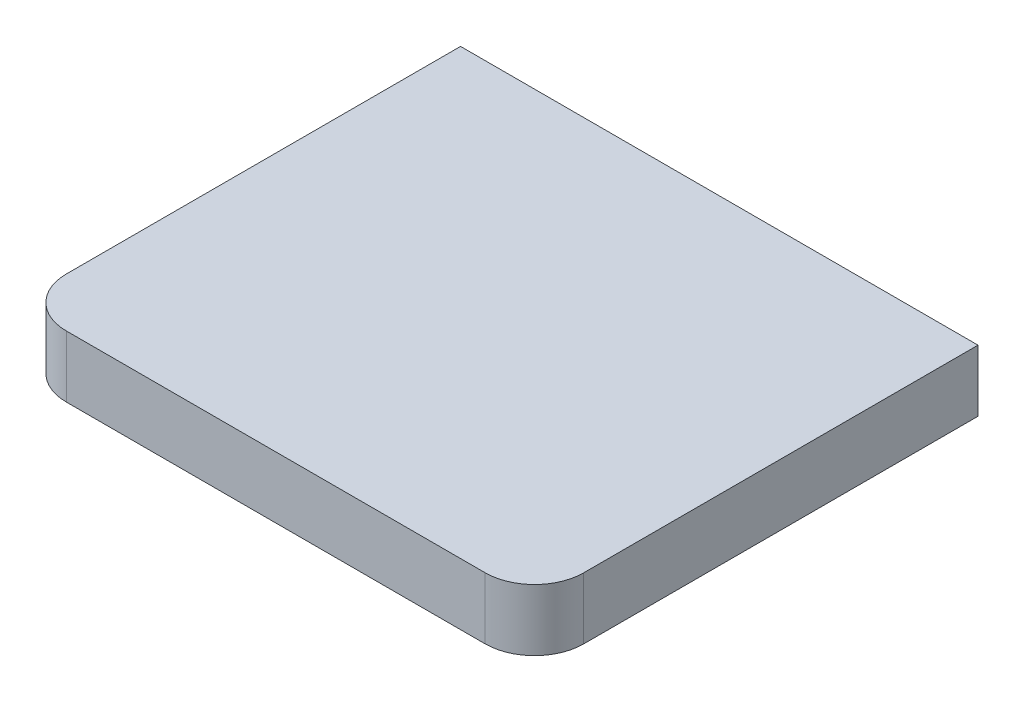
ISO-10303-21;
HEADER;
FILE_DESCRIPTION(('STEP AP214'),'2;1');
FILE_NAME('part.step','',(''),(''),'','','');
FILE_SCHEMA(('AUTOMOTIVE_DESIGN { 1 0 10303 214 1 1 1 1 }'));
ENDSEC;
DATA;
#1=APPLICATION_CONTEXT('core data for automotive mechanical design processes');
#2=APPLICATION_PROTOCOL_DEFINITION('international standard','automotive_design',2000,#1);
#3=PRODUCT_CONTEXT('',#1,'mechanical');
#4=PRODUCT('Part','Part','',(#3));
#5=PRODUCT_RELATED_PRODUCT_CATEGORY('part','',(#4));
#6=PRODUCT_DEFINITION_FORMATION('','',#4);
#7=PRODUCT_DEFINITION_CONTEXT('part definition',#1,'design');
#8=PRODUCT_DEFINITION('design','',#6,#7);
#9=PRODUCT_DEFINITION_SHAPE('','',#8);
#10=(LENGTH_UNIT() NAMED_UNIT(*) SI_UNIT(.MILLI.,.METRE.));
#11=(NAMED_UNIT(*) PLANE_ANGLE_UNIT() SI_UNIT($,.RADIAN.));
#12=(NAMED_UNIT(*) SI_UNIT($,.STERADIAN.) SOLID_ANGLE_UNIT());
#13=UNCERTAINTY_MEASURE_WITH_UNIT(LENGTH_MEASURE(1.E-05),#10,'distance_accuracy_value','');
#14=(GEOMETRIC_REPRESENTATION_CONTEXT(3) GLOBAL_UNCERTAINTY_ASSIGNED_CONTEXT((#13)) GLOBAL_UNIT_ASSIGNED_CONTEXT((#10,
#11,#12)) REPRESENTATION_CONTEXT('',''));
#15=CARTESIAN_POINT('',(0.,0.,0.));
#16=DIRECTION('',(0.,0.,1.));
#17=DIRECTION('',(1.,0.,0.));
#18=AXIS2_PLACEMENT_3D('',#15,#16,#17);
#19=CARTESIAN_POINT('',(210.,50.,140.));
#20=DIRECTION('',(-1.,0.,0.));
#21=DIRECTION('',(0.,0.,1.));
#22=AXIS2_PLACEMENT_3D('',#19,#20,#21);
#23=PLANE('',#22);
#24=DIRECTION('',(0.,0.,-1.));
#25=VECTOR('',#24,1.);
#26=CARTESIAN_POINT('',(210.,0.,140.));
#27=LINE('',#26,#25);
#28=CARTESIAN_POINT('',(210.,0.,140.));
#29=VERTEX_POINT('',#28);
#30=CARTESIAN_POINT('',(210.,0.,-180.));
#31=VERTEX_POINT('',#30);
#32=EDGE_CURVE('E133',#29,#31,#27,.T.);
#33=ORIENTED_EDGE('',*,*,#32,.T.);
#34=DIRECTION('',(0.,-1.,0.));
#35=VECTOR('',#34,1.);
#36=CARTESIAN_POINT('',(210.,50.,-180.));
#37=LINE('',#36,#35);
#38=CARTESIAN_POINT('',(210.,50.,-180.));
#39=VERTEX_POINT('',#38);
#40=EDGE_CURVE('E11',#39,#31,#37,.T.);
#41=ORIENTED_EDGE('',*,*,#40,.F.);
#42=DIRECTION('',(0.,0.,-1.));
#43=VECTOR('',#42,1.);
#44=CARTESIAN_POINT('',(210.,50.,140.));
#45=LINE('',#44,#43);
#46=CARTESIAN_POINT('',(210.,50.,140.));
#47=VERTEX_POINT('',#46);
#48=EDGE_CURVE('E150',#47,#39,#45,.T.);
#49=ORIENTED_EDGE('',*,*,#48,.F.);
#50=DIRECTION('',(0.,-1.,0.));
#51=VECTOR('',#50,1.);
#52=CARTESIAN_POINT('',(210.,50.,140.));
#53=LINE('',#52,#51);
#54=EDGE_CURVE('E129',#47,#29,#53,.T.);
#55=ORIENTED_EDGE('',*,*,#54,.T.);
#56=EDGE_LOOP('',(#33,#41,#49,#55));
#57=FACE_BOUND('',#56,.T.);
#58=ADVANCED_FACE('F44',(#57),#23,.F.);
#59=CARTESIAN_POINT('',(-210.,50.,-180.));
#60=DIRECTION('',(0.,0.,1.));
#61=DIRECTION('',(1.,0.,0.));
#62=AXIS2_PLACEMENT_3D('',#59,#60,#61);
#63=PLANE('',#62);
#64=DIRECTION('',(-1.,0.,0.));
#65=VECTOR('',#64,1.);
#66=CARTESIAN_POINT('',(-210.,0.,-180.));
#67=LINE('',#66,#65);
#68=CARTESIAN_POINT('',(-210.,0.,-180.));
#69=VERTEX_POINT('',#68);
#70=EDGE_CURVE('E137',#31,#69,#67,.T.);
#71=ORIENTED_EDGE('',*,*,#70,.T.);
#72=DIRECTION('',(0.,-1.,0.));
#73=VECTOR('',#72,1.);
#74=CARTESIAN_POINT('',(-210.,50.,-180.));
#75=LINE('',#74,#73);
#76=CARTESIAN_POINT('',(-210.,50.,-180.));
#77=VERTEX_POINT('',#76);
#78=EDGE_CURVE('E53',#77,#69,#75,.T.);
#79=ORIENTED_EDGE('',*,*,#78,.F.);
#80=DIRECTION('',(-1.,0.,0.));
#81=VECTOR('',#80,1.);
#82=CARTESIAN_POINT('',(-210.,50.,-180.));
#83=LINE('',#82,#81);
#84=EDGE_CURVE('E98',#39,#77,#83,.T.);
#85=ORIENTED_EDGE('',*,*,#84,.F.);
#86=ORIENTED_EDGE('',*,*,#40,.T.);
#87=EDGE_LOOP('',(#71,#79,#85,#86));
#88=FACE_BOUND('',#87,.T.);
#89=ADVANCED_FACE('F178',(#88),#63,.F.);
#90=CARTESIAN_POINT('',(-210.,50.,140.));
#91=DIRECTION('',(1.,0.,0.));
#92=DIRECTION('',(0.,0.,-1.));
#93=AXIS2_PLACEMENT_3D('',#90,#91,#92);
#94=PLANE('',#93);
#95=DIRECTION('',(0.,0.,1.));
#96=VECTOR('',#95,1.);
#97=CARTESIAN_POINT('',(-210.,0.,140.));
#98=LINE('',#97,#96);
#99=CARTESIAN_POINT('',(-210.,0.,140.));
#100=VERTEX_POINT('',#99);
#101=EDGE_CURVE('E141',#69,#100,#98,.T.);
#102=ORIENTED_EDGE('',*,*,#101,.T.);
#103=DIRECTION('',(0.,-1.,0.));
#104=VECTOR('',#103,1.);
#105=CARTESIAN_POINT('',(-210.,50.,140.));
#106=LINE('',#105,#104);
#107=CARTESIAN_POINT('',(-210.,50.,140.));
#108=VERTEX_POINT('',#107);
#109=EDGE_CURVE('E122',#108,#100,#106,.T.);
#110=ORIENTED_EDGE('',*,*,#109,.F.);
#111=DIRECTION('',(0.,0.,1.));
#112=VECTOR('',#111,1.);
#113=CARTESIAN_POINT('',(-210.,50.,140.));
#114=LINE('',#113,#112);
#115=EDGE_CURVE('E111',#77,#108,#114,.T.);
#116=ORIENTED_EDGE('',*,*,#115,.F.);
#117=ORIENTED_EDGE('',*,*,#78,.T.);
#118=EDGE_LOOP('',(#102,#110,#116,#117));
#119=FACE_BOUND('',#118,.T.);
#120=ADVANCED_FACE('F160',(#119),#94,.F.);
#121=CARTESIAN_POINT('',(-170.,50.,140.));
#122=DIRECTION('',(0.,-1.,0.));
#123=DIRECTION('',(0.,0.,-1.));
#124=AXIS2_PLACEMENT_3D('',#121,#122,#123);
#125=CYLINDRICAL_SURFACE('',#124,40.);
#126=CARTESIAN_POINT('',(-170.,0.,140.));
#127=DIRECTION('',(0.,1.,0.));
#128=DIRECTION('',(0.,0.,-1.));
#129=AXIS2_PLACEMENT_3D('',#126,#127,#128);
#130=CIRCLE('',#129,40.);
#131=CARTESIAN_POINT('',(-170.,0.,180.));
#132=VERTEX_POINT('',#131);
#133=EDGE_CURVE('E120',#100,#132,#130,.T.);
#134=ORIENTED_EDGE('',*,*,#133,.T.);
#135=DIRECTION('',(0.,-1.,0.));
#136=VECTOR('',#135,1.);
#137=CARTESIAN_POINT('',(-170.,50.,180.));
#138=LINE('',#137,#136);
#139=CARTESIAN_POINT('',(-170.,50.,180.));
#140=VERTEX_POINT('',#139);
#141=EDGE_CURVE('E117',#140,#132,#138,.T.);
#142=ORIENTED_EDGE('',*,*,#141,.F.);
#143=CARTESIAN_POINT('',(-170.,50.,140.));
#144=DIRECTION('',(0.,1.,0.));
#145=DIRECTION('',(0.,0.,-1.));
#146=AXIS2_PLACEMENT_3D('',#143,#144,#145);
#147=CIRCLE('',#146,40.);
#148=EDGE_CURVE('E105',#108,#140,#147,.T.);
#149=ORIENTED_EDGE('',*,*,#148,.F.);
#150=ORIENTED_EDGE('',*,*,#109,.T.);
#151=EDGE_LOOP('',(#134,#142,#149,#150));
#152=FACE_BOUND('',#151,.T.);
#153=ADVANCED_FACE('F118',(#152),#125,.T.);
#154=CARTESIAN_POINT('',(-170.,50.,180.));
#155=DIRECTION('',(0.,0.,-1.));
#156=DIRECTION('',(-1.,0.,0.));
#157=AXIS2_PLACEMENT_3D('',#154,#155,#156);
#158=PLANE('',#157);
#159=DIRECTION('',(1.,0.,0.));
#160=VECTOR('',#159,1.);
#161=CARTESIAN_POINT('',(-170.,0.,180.));
#162=LINE('',#161,#160);
#163=CARTESIAN_POINT('',(170.,0.,180.));
#164=VERTEX_POINT('',#163);
#165=EDGE_CURVE('E84',#132,#164,#162,.T.);
#166=ORIENTED_EDGE('',*,*,#165,.T.);
#167=DIRECTION('',(0.,-1.,0.));
#168=VECTOR('',#167,1.);
#169=CARTESIAN_POINT('',(170.,50.,180.));
#170=LINE('',#169,#168);
#171=CARTESIAN_POINT('',(170.,50.,180.));
#172=VERTEX_POINT('',#171);
#173=EDGE_CURVE('E123',#172,#164,#170,.T.);
#174=ORIENTED_EDGE('',*,*,#173,.F.);
#175=DIRECTION('',(1.,0.,0.));
#176=VECTOR('',#175,1.);
#177=CARTESIAN_POINT('',(-170.,50.,180.));
#178=LINE('',#177,#176);
#179=EDGE_CURVE('E109',#140,#172,#178,.T.);
#180=ORIENTED_EDGE('',*,*,#179,.F.);
#181=ORIENTED_EDGE('',*,*,#141,.T.);
#182=EDGE_LOOP('',(#166,#174,#180,#181));
#183=FACE_BOUND('',#182,.T.);
#184=ADVANCED_FACE('F125',(#183),#158,.F.);
#185=CARTESIAN_POINT('',(170.,50.,140.));
#186=DIRECTION('',(0.,-1.,0.));
#187=DIRECTION('',(0.,0.,-1.));
#188=AXIS2_PLACEMENT_3D('',#185,#186,#187);
#189=CYLINDRICAL_SURFACE('',#188,40.);
#190=CARTESIAN_POINT('',(170.,0.,140.));
#191=DIRECTION('',(0.,1.,0.));
#192=DIRECTION('',(0.,0.,1.));
#193=AXIS2_PLACEMENT_3D('',#190,#191,#192);
#194=CIRCLE('',#193,40.);
#195=EDGE_CURVE('E90',#164,#29,#194,.T.);
#196=ORIENTED_EDGE('',*,*,#195,.T.);
#197=ORIENTED_EDGE('',*,*,#54,.F.);
#198=CARTESIAN_POINT('',(170.,50.,140.));
#199=DIRECTION('',(0.,1.,0.));
#200=DIRECTION('',(0.,0.,1.));
#201=AXIS2_PLACEMENT_3D('',#198,#199,#200);
#202=CIRCLE('',#201,40.);
#203=EDGE_CURVE('E61',#172,#47,#202,.T.);
#204=ORIENTED_EDGE('',*,*,#203,.F.);
#205=ORIENTED_EDGE('',*,*,#173,.T.);
#206=EDGE_LOOP('',(#196,#197,#204,#205));
#207=FACE_BOUND('',#206,.T.);
#208=ADVANCED_FACE('F167',(#207),#189,.T.);
#209=CARTESIAN_POINT('',(-170.,50.,140.));
#210=DIRECTION('',(0.,-1.,0.));
#211=DIRECTION('',(0.,0.,-1.));
#212=AXIS2_PLACEMENT_3D('',#209,#210,#211);
#213=PLANE('',#212);
#214=ORIENTED_EDGE('',*,*,#48,.T.);
#215=ORIENTED_EDGE('',*,*,#84,.T.);
#216=ORIENTED_EDGE('',*,*,#115,.T.);
#217=ORIENTED_EDGE('',*,*,#148,.T.);
#218=ORIENTED_EDGE('',*,*,#179,.T.);
#219=ORIENTED_EDGE('',*,*,#203,.T.);
#220=EDGE_LOOP('',(#214,#215,#216,#217,#218,#219));
#221=FACE_BOUND('',#220,.T.);
#222=ADVANCED_FACE('F107',(#221),#213,.F.);
#223=CARTESIAN_POINT('',(-170.,0.,140.));
#224=DIRECTION('',(0.,-1.,0.));
#225=DIRECTION('',(0.,0.,-1.));
#226=AXIS2_PLACEMENT_3D('',#223,#224,#225);
#227=PLANE('',#226);
#228=CARTESIAN_POINT('',(170.,0.,90.));
#229=DIRECTION('',(0.,-1.,0.));
#230=DIRECTION('',(0.,0.,1.));
#231=AXIS2_PLACEMENT_3D('',#228,#229,#230);
#232=CIRCLE('',#231,3.99999999999999);
#233=CARTESIAN_POINT('',(170.,0.,94.));
#234=VERTEX_POINT('',#233);
#235=EDGE_CURVE('E303',#234,#234,#232,.T.);
#236=ORIENTED_EDGE('',*,*,#235,.F.);
#237=EDGE_LOOP('',(#236));
#238=FACE_BOUND('',#237,.T.);
#239=CARTESIAN_POINT('',(170.,0.,-90.));
#240=DIRECTION('',(0.,-1.,0.));
#241=DIRECTION('',(0.,0.,-1.));
#242=AXIS2_PLACEMENT_3D('',#239,#240,#241);
#243=CIRCLE('',#242,3.99999999999999);
#244=CARTESIAN_POINT('',(170.,0.,-94.));
#245=VERTEX_POINT('',#244);
#246=EDGE_CURVE('E330',#245,#245,#243,.T.);
#247=ORIENTED_EDGE('',*,*,#246,.F.);
#248=EDGE_LOOP('',(#247));
#249=FACE_BOUND('',#248,.T.);
#250=CARTESIAN_POINT('',(-170.,0.,-90.));
#251=DIRECTION('',(0.,-1.,0.));
#252=DIRECTION('',(0.,0.,1.));
#253=AXIS2_PLACEMENT_3D('',#250,#251,#252);
#254=CIRCLE('',#253,3.99999999999999);
#255=CARTESIAN_POINT('',(-170.,0.,-86.));
#256=VERTEX_POINT('',#255);
#257=EDGE_CURVE('E318',#256,#256,#254,.T.);
#258=ORIENTED_EDGE('',*,*,#257,.F.);
#259=EDGE_LOOP('',(#258));
#260=FACE_BOUND('',#259,.T.);
#261=CARTESIAN_POINT('',(-170.,0.,90.));
#262=DIRECTION('',(0.,-1.,0.));
#263=DIRECTION('',(0.,0.,-1.));
#264=AXIS2_PLACEMENT_3D('',#261,#262,#263);
#265=CIRCLE('',#264,3.99999999999999);
#266=CARTESIAN_POINT('',(-170.,0.,86.));
#267=VERTEX_POINT('',#266);
#268=EDGE_CURVE('E314',#267,#267,#265,.T.);
#269=ORIENTED_EDGE('',*,*,#268,.F.);
#270=EDGE_LOOP('',(#269));
#271=FACE_BOUND('',#270,.T.);
#272=ORIENTED_EDGE('',*,*,#32,.F.);
#273=ORIENTED_EDGE('',*,*,#195,.F.);
#274=ORIENTED_EDGE('',*,*,#165,.F.);
#275=ORIENTED_EDGE('',*,*,#133,.F.);
#276=ORIENTED_EDGE('',*,*,#101,.F.);
#277=ORIENTED_EDGE('',*,*,#70,.F.);
#278=EDGE_LOOP('',(#272,#273,#274,#275,#276,#277));
#279=FACE_BOUND('',#278,.T.);
#280=ADVANCED_FACE('F163',(#238,#249,#260,#271,#279),#227,.T.);
#281=CARTESIAN_POINT('',(-170.,25.,90.));
#282=DIRECTION('',(0.,-1.,0.));
#283=DIRECTION('',(0.,0.,-1.));
#284=AXIS2_PLACEMENT_3D('',#281,#282,#283);
#285=CYLINDRICAL_SURFACE('',#284,3.99999999999999);
#286=CARTESIAN_POINT('',(-170.,25.,90.));
#287=DIRECTION('',(0.,-1.,0.));
#288=DIRECTION('',(0.,0.,-1.));
#289=AXIS2_PLACEMENT_3D('',#286,#287,#288);
#290=CIRCLE('',#289,3.99999999999999);
#291=CARTESIAN_POINT('',(-170.,25.,86.));
#292=VERTEX_POINT('',#291);
#293=EDGE_CURVE('E138',#292,#292,#290,.T.);
#294=ORIENTED_EDGE('',*,*,#293,.F.);
#295=EDGE_LOOP('',(#294));
#296=FACE_BOUND('',#295,.T.);
#297=ORIENTED_EDGE('',*,*,#268,.T.);
#298=EDGE_LOOP('',(#297));
#299=FACE_BOUND('',#298,.T.);
#300=ADVANCED_FACE('F217',(#296,#299),#285,.F.);
#301=CARTESIAN_POINT('',(-170.,25.,90.));
#302=DIRECTION('',(0.,-1.,0.));
#303=DIRECTION('',(0.,0.,-1.));
#304=AXIS2_PLACEMENT_3D('',#301,#302,#303);
#305=PLANE('',#304);
#306=ORIENTED_EDGE('',*,*,#293,.T.);
#307=EDGE_LOOP('',(#306));
#308=FACE_BOUND('',#307,.T.);
#309=ADVANCED_FACE('F226',(#308),#305,.T.);
#310=CARTESIAN_POINT('',(-170.,25.,-90.));
#311=DIRECTION('',(0.,-1.,0.));
#312=DIRECTION('',(0.,0.,-1.));
#313=AXIS2_PLACEMENT_3D('',#310,#311,#312);
#314=CYLINDRICAL_SURFACE('',#313,3.99999999999999);
#315=CARTESIAN_POINT('',(-170.,25.,-90.));
#316=DIRECTION('',(0.,-1.,0.));
#317=DIRECTION('',(0.,0.,1.));
#318=AXIS2_PLACEMENT_3D('',#315,#316,#317);
#319=CIRCLE('',#318,3.99999999999999);
#320=CARTESIAN_POINT('',(-170.,25.,-86.));
#321=VERTEX_POINT('',#320);
#322=EDGE_CURVE('E326',#321,#321,#319,.T.);
#323=ORIENTED_EDGE('',*,*,#322,.F.);
#324=EDGE_LOOP('',(#323));
#325=FACE_BOUND('',#324,.T.);
#326=ORIENTED_EDGE('',*,*,#257,.T.);
#327=EDGE_LOOP('',(#326));
#328=FACE_BOUND('',#327,.T.);
#329=ADVANCED_FACE('F236',(#325,#328),#314,.F.);
#330=CARTESIAN_POINT('',(-170.,25.,-90.));
#331=DIRECTION('',(0.,1.,0.));
#332=DIRECTION('',(0.,0.,1.));
#333=AXIS2_PLACEMENT_3D('',#330,#331,#332);
#334=PLANE('',#333);
#335=ORIENTED_EDGE('',*,*,#322,.T.);
#336=EDGE_LOOP('',(#335));
#337=FACE_BOUND('',#336,.T.);
#338=ADVANCED_FACE('F246',(#337),#334,.F.);
#339=CARTESIAN_POINT('',(170.,25.,-90.));
#340=DIRECTION('',(0.,-1.,0.));
#341=DIRECTION('',(0.,0.,-1.));
#342=AXIS2_PLACEMENT_3D('',#339,#340,#341);
#343=CYLINDRICAL_SURFACE('',#342,3.99999999999999);
#344=CARTESIAN_POINT('',(170.,25.,-90.));
#345=DIRECTION('',(0.,-1.,0.));
#346=DIRECTION('',(0.,0.,-1.));
#347=AXIS2_PLACEMENT_3D('',#344,#345,#346);
#348=CIRCLE('',#347,3.99999999999999);
#349=CARTESIAN_POINT('',(170.,25.,-94.));
#350=VERTEX_POINT('',#349);
#351=EDGE_CURVE('E307',#350,#350,#348,.T.);
#352=ORIENTED_EDGE('',*,*,#351,.F.);
#353=EDGE_LOOP('',(#352));
#354=FACE_BOUND('',#353,.T.);
#355=ORIENTED_EDGE('',*,*,#246,.T.);
#356=EDGE_LOOP('',(#355));
#357=FACE_BOUND('',#356,.T.);
#358=ADVANCED_FACE('F256',(#354,#357),#343,.F.);
#359=CARTESIAN_POINT('',(170.,25.,-90.));
#360=DIRECTION('',(0.,-1.,0.));
#361=DIRECTION('',(0.,0.,-1.));
#362=AXIS2_PLACEMENT_3D('',#359,#360,#361);
#363=PLANE('',#362);
#364=ORIENTED_EDGE('',*,*,#351,.T.);
#365=EDGE_LOOP('',(#364));
#366=FACE_BOUND('',#365,.T.);
#367=ADVANCED_FACE('F266',(#366),#363,.T.);
#368=CARTESIAN_POINT('',(170.,25.,90.));
#369=DIRECTION('',(0.,-1.,0.));
#370=DIRECTION('',(0.,0.,-1.));
#371=AXIS2_PLACEMENT_3D('',#368,#369,#370);
#372=CYLINDRICAL_SURFACE('',#371,3.99999999999999);
#373=CARTESIAN_POINT('',(170.,25.,90.));
#374=DIRECTION('',(0.,-1.,0.));
#375=DIRECTION('',(0.,0.,1.));
#376=AXIS2_PLACEMENT_3D('',#373,#374,#375);
#377=CIRCLE('',#376,3.99999999999999);
#378=CARTESIAN_POINT('',(170.,25.,94.));
#379=VERTEX_POINT('',#378);
#380=EDGE_CURVE('E301',#379,#379,#377,.T.);
#381=ORIENTED_EDGE('',*,*,#380,.F.);
#382=EDGE_LOOP('',(#381));
#383=FACE_BOUND('',#382,.T.);
#384=ORIENTED_EDGE('',*,*,#235,.T.);
#385=EDGE_LOOP('',(#384));
#386=FACE_BOUND('',#385,.T.);
#387=ADVANCED_FACE('F276',(#383,#386),#372,.F.);
#388=CARTESIAN_POINT('',(170.,25.,90.));
#389=DIRECTION('',(0.,1.,0.));
#390=DIRECTION('',(0.,0.,1.));
#391=AXIS2_PLACEMENT_3D('',#388,#389,#390);
#392=PLANE('',#391);
#393=ORIENTED_EDGE('',*,*,#380,.T.);
#394=EDGE_LOOP('',(#393));
#395=FACE_BOUND('',#394,.T.);
#396=ADVANCED_FACE('F286',(#395),#392,.F.);
#397=CLOSED_SHELL('',(#58,#89,#120,#153,#184,#208,#222,#280,#300,#309,#329,#338,#358,#367,#387,#396));
#398=MANIFOLD_SOLID_BREP('B2',#397);
#399=ADVANCED_BREP_SHAPE_REPRESENTATION('',(#18,#398),#14);
#400=SHAPE_DEFINITION_REPRESENTATION(#9,#399);
ENDSEC;
END-ISO-10303-21;
